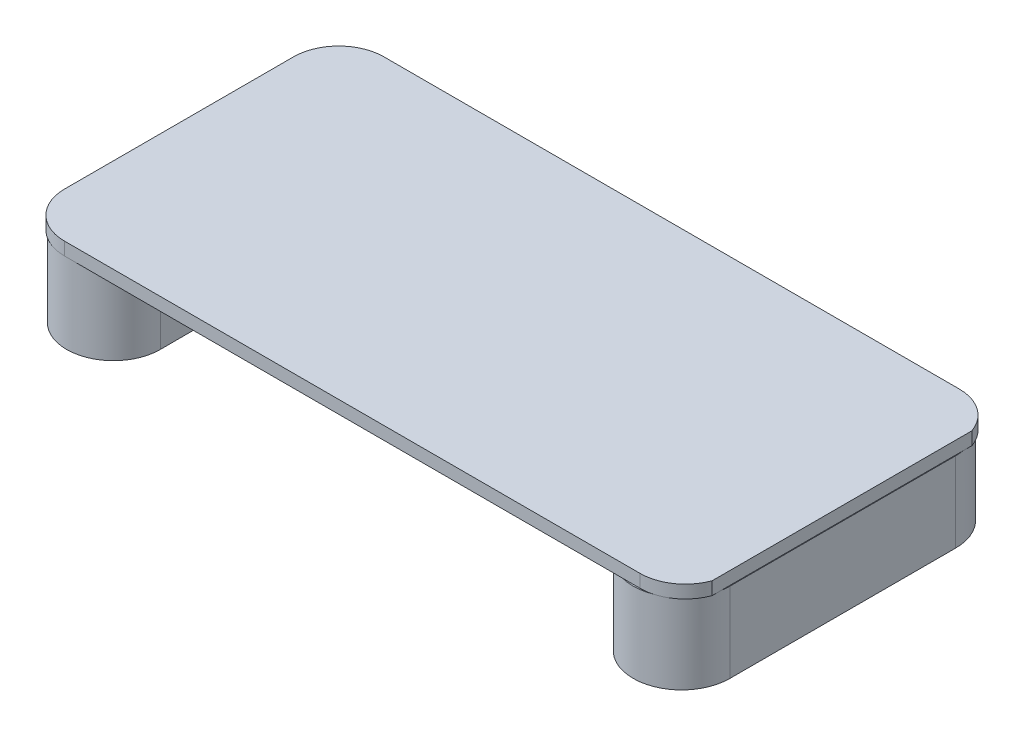
ISO-10303-21;
HEADER;
FILE_DESCRIPTION(('STEP AP214'),'2;1');
FILE_NAME('part.step','',(''),(''),'','','');
FILE_SCHEMA(('AUTOMOTIVE_DESIGN { 1 0 10303 214 1 1 1 1 }'));
ENDSEC;
DATA;
#1=APPLICATION_CONTEXT('core data for automotive mechanical design processes');
#2=APPLICATION_PROTOCOL_DEFINITION('international standard','automotive_design',2000,#1);
#3=PRODUCT_CONTEXT('',#1,'mechanical');
#4=PRODUCT('Part','Part','',(#3));
#5=PRODUCT_RELATED_PRODUCT_CATEGORY('part','',(#4));
#6=PRODUCT_DEFINITION_FORMATION('','',#4);
#7=PRODUCT_DEFINITION_CONTEXT('part definition',#1,'design');
#8=PRODUCT_DEFINITION('design','',#6,#7);
#9=PRODUCT_DEFINITION_SHAPE('','',#8);
#10=(LENGTH_UNIT() NAMED_UNIT(*) SI_UNIT(.MILLI.,.METRE.));
#11=(NAMED_UNIT(*) PLANE_ANGLE_UNIT() SI_UNIT($,.RADIAN.));
#12=(NAMED_UNIT(*) SI_UNIT($,.STERADIAN.) SOLID_ANGLE_UNIT());
#13=UNCERTAINTY_MEASURE_WITH_UNIT(LENGTH_MEASURE(1.E-05),#10,'distance_accuracy_value','');
#14=(GEOMETRIC_REPRESENTATION_CONTEXT(3) GLOBAL_UNCERTAINTY_ASSIGNED_CONTEXT((#13)) GLOBAL_UNIT_ASSIGNED_CONTEXT((#10,
#11,#12)) REPRESENTATION_CONTEXT('',''));
#15=CARTESIAN_POINT('',(0.,0.,0.));
#16=DIRECTION('',(0.,0.,1.));
#17=DIRECTION('',(1.,0.,0.));
#18=AXIS2_PLACEMENT_3D('',#15,#16,#17);
#19=CARTESIAN_POINT('',(0.,20.7,0.));
#20=DIRECTION('',(0.,1.,0.));
#21=DIRECTION('',(0.,0.,1.));
#22=AXIS2_PLACEMENT_3D('',#19,#20,#21);
#23=PLANE('',#22);
#24=CARTESIAN_POINT('',(88.1765540655378,20.7,0.));
#25=DIRECTION('',(0.,-1.,0.));
#26=DIRECTION('',(0.,0.,-1.));
#27=AXIS2_PLACEMENT_3D('',#24,#25,#26);
#28=CIRCLE('',#27,7.49999999999999);
#29=CARTESIAN_POINT('',(90.8872409401359,20.7,-6.99300912825669));
#30=VERTEX_POINT('',#29);
#31=CARTESIAN_POINT('',(95.5769038390663,20.7,-1.21853322869612));
#32=VERTEX_POINT('',#31);
#33=EDGE_CURVE('E495',#30,#32,#28,.T.);
#34=ORIENTED_EDGE('',*,*,#33,.F.);
#35=CARTESIAN_POINT('',(88.9969038390663,20.7,-0.253081410222929));
#36=DIRECTION('',(0.,1.,0.));
#37=DIRECTION('',(0.,0.,1.));
#38=AXIS2_PLACEMENT_3D('',#35,#36,#37);
#39=CIRCLE('',#38,7.);
#40=CARTESIAN_POINT('',(95.5769038390663,20.7,-2.6413025055154));
#41=VERTEX_POINT('',#40);
#42=EDGE_CURVE('E435',#30,#41,#39,.F.);
#43=ORIENTED_EDGE('',*,*,#42,.T.);
#44=DIRECTION('',(0.,0.,1.));
#45=VECTOR('',#44,1.);
#46=CARTESIAN_POINT('',(95.5769038390663,20.7,0.));
#47=LINE('',#46,#45);
#48=EDGE_CURVE('E227',#41,#32,#47,.T.);
#49=ORIENTED_EDGE('',*,*,#48,.T.);
#50=EDGE_LOOP('',(#34,#43,#49));
#51=FACE_BOUND('',#50,.T.);
#52=ADVANCED_FACE('F41',(#51),#23,.F.);
#53=CARTESIAN_POINT('',(88.1765540655378,20.7,35.01));
#54=DIRECTION('',(0.,-1.,0.));
#55=DIRECTION('',(0.,0.,-1.));
#56=AXIS2_PLACEMENT_3D('',#53,#54,#55);
#57=CIRCLE('',#56,7.50000000000002);
#58=CARTESIAN_POINT('',(95.5769038390663,20.7,36.2285332286963));
#59=VERTEX_POINT('',#58);
#60=CARTESIAN_POINT('',(90.8484712410928,20.7,42.0179139982576));
#61=VERTEX_POINT('',#60);
#62=EDGE_CURVE('E426',#59,#61,#57,.T.);
#63=ORIENTED_EDGE('',*,*,#62,.F.);
#64=CARTESIAN_POINT('',(95.5769038390663,20.7,37.6554537830635));
#65=VERTEX_POINT('',#64);
#66=EDGE_CURVE('E226',#59,#65,#47,.T.);
#67=ORIENTED_EDGE('',*,*,#66,.T.);
#68=CARTESIAN_POINT('',(88.9969038390663,20.7,35.267232687771));
#69=DIRECTION('',(0.,1.,0.));
#70=DIRECTION('',(0.,0.,1.));
#71=AXIS2_PLACEMENT_3D('',#68,#69,#70);
#72=CIRCLE('',#71,7.);
#73=EDGE_CURVE('E423',#65,#61,#72,.F.);
#74=ORIENTED_EDGE('',*,*,#73,.T.);
#75=EDGE_LOOP('',(#63,#67,#74));
#76=FACE_BOUND('',#75,.T.);
#77=ADVANCED_FACE('F362',(#76),#23,.F.);
#78=CARTESIAN_POINT('',(80.6765540655378,20.7,0.));
#79=VERTEX_POINT('',#78);
#80=CARTESIAN_POINT('',(86.2679393698283,20.7,-7.25308141022293));
#81=VERTEX_POINT('',#80);
#82=EDGE_CURVE('E59',#79,#81,#28,.T.);
#83=ORIENTED_EDGE('',*,*,#82,.F.);
#84=DIRECTION('',(0.,0.,-1.));
#85=VECTOR('',#84,1.);
#86=CARTESIAN_POINT('',(80.6765540655378,20.7,0.));
#87=LINE('',#86,#85);
#88=CARTESIAN_POINT('',(80.6765540655378,20.7,35.01));
#89=VERTEX_POINT('',#88);
#90=EDGE_CURVE('E63',#89,#79,#87,.T.);
#91=ORIENTED_EDGE('',*,*,#90,.F.);
#92=CARTESIAN_POINT('',(86.2837852694223,20.7,42.267232687771));
#93=VERTEX_POINT('',#92);
#94=EDGE_CURVE('E501',#93,#89,#57,.T.);
#95=ORIENTED_EDGE('',*,*,#94,.F.);
#96=DIRECTION('',(1.,0.,0.));
#97=VECTOR('',#96,1.);
#98=CARTESIAN_POINT('',(-7.25309616093367,20.7,42.267232687771));
#99=LINE('',#98,#97);
#100=CARTESIAN_POINT('',(-0.253096160933671,20.7,42.267232687771));
#101=VERTEX_POINT('',#100);
#102=EDGE_CURVE('E253',#101,#93,#99,.T.);
#103=ORIENTED_EDGE('',*,*,#102,.F.);
#104=CARTESIAN_POINT('',(-0.253096160933671,20.7,35.267232687771));
#105=DIRECTION('',(0.,1.,0.));
#106=DIRECTION('',(0.,0.,1.));
#107=AXIS2_PLACEMENT_3D('',#104,#105,#106);
#108=CIRCLE('',#107,7.);
#109=CARTESIAN_POINT('',(-7.25309616093367,20.7,35.267232687771));
#110=VERTEX_POINT('',#109);
#111=EDGE_CURVE('E436',#101,#110,#108,.F.);
#112=ORIENTED_EDGE('',*,*,#111,.T.);
#113=DIRECTION('',(0.,0.,1.));
#114=VECTOR('',#113,1.);
#115=CARTESIAN_POINT('',(-7.25309616093368,20.7,-7.25308141022293));
#116=LINE('',#115,#114);
#117=CARTESIAN_POINT('',(-7.25309616093368,20.7,0.));
#118=VERTEX_POINT('',#117);
#119=EDGE_CURVE('E235',#118,#110,#116,.T.);
#120=ORIENTED_EDGE('',*,*,#119,.F.);
#121=CARTESIAN_POINT('',(0.,20.7,0.));
#122=DIRECTION('',(0.,1.,0.));
#123=DIRECTION('',(0.,0.,1.));
#124=AXIS2_PLACEMENT_3D('',#121,#122,#123);
#125=CIRCLE('',#124,7.25309616093368);
#126=CARTESIAN_POINT('',(-7.25308141022293,20.7,0.0146279331896265));
#127=VERTEX_POINT('',#126);
#128=EDGE_CURVE('E259',#118,#127,#125,.T.);
#129=ORIENTED_EDGE('',*,*,#128,.T.);
#130=DIRECTION('',(0.0020167846758209,0.,0.999997966287718));
#131=VECTOR('',#130,1.);
#132=CARTESIAN_POINT('',(-7.25308141022293,20.7,0.0146279331896265));
#133=LINE('',#132,#131);
#134=CARTESIAN_POINT('',(-7.18247102120448,20.7,35.0259240144122));
#135=VERTEX_POINT('',#134);
#136=EDGE_CURVE('E275',#127,#135,#133,.T.);
#137=ORIENTED_EDGE('',*,*,#136,.T.);
#138=CARTESIAN_POINT('',(0.0706103890184538,20.7,35.0112960812226));
#139=DIRECTION('',(0.,1.,0.));
#140=DIRECTION('',(0.,0.,1.));
#141=AXIS2_PLACEMENT_3D('',#138,#139,#140);
#142=CIRCLE('',#141,7.25309616093368);
#143=CARTESIAN_POINT('',(7.32369179924138,20.7,34.9966681480329));
#144=VERTEX_POINT('',#143);
#145=EDGE_CURVE('E279',#135,#144,#142,.T.);
#146=ORIENTED_EDGE('',*,*,#145,.T.);
#147=DIRECTION('',(-0.0020167846758209,0.,-0.999997966287718));
#148=VECTOR('',#147,1.);
#149=CARTESIAN_POINT('',(7.25308141022293,20.7,-0.0146279331896265));
#150=LINE('',#149,#148);
#151=CARTESIAN_POINT('',(7.25308141022293,20.7,-0.0146279331896265));
#152=VERTEX_POINT('',#151);
#153=EDGE_CURVE('E284',#144,#152,#150,.T.);
#154=ORIENTED_EDGE('',*,*,#153,.T.);
#155=CARTESIAN_POINT('',(0.0146279331901802,20.7,-7.25308141022293));
#156=VERTEX_POINT('',#155);
#157=EDGE_CURVE('E280',#152,#156,#125,.T.);
#158=ORIENTED_EDGE('',*,*,#157,.T.);
#159=DIRECTION('',(-1.,0.,0.));
#160=VECTOR('',#159,1.);
#161=CARTESIAN_POINT('',(-7.25309616093368,20.7,-7.25308141022293));
#162=LINE('',#161,#160);
#163=EDGE_CURVE('E45',#81,#156,#162,.T.);
#164=ORIENTED_EDGE('',*,*,#163,.F.);
#165=EDGE_LOOP('',(#83,#91,#95,#103,#112,#120,#129,#137,#146,#154,#158,#164));
#166=FACE_BOUND('',#165,.T.);
#167=ADVANCED_FACE('F369',(#166),#23,.F.);
#168=CARTESIAN_POINT('',(0.,8.3,0.));
#169=DIRECTION('',(0.,1.,0.));
#170=DIRECTION('',(0.,0.,1.));
#171=AXIS2_PLACEMENT_3D('',#168,#169,#170);
#172=PLANE('',#171);
#173=CARTESIAN_POINT('',(0.,8.3,0.));
#174=DIRECTION('',(0.,1.,0.));
#175=DIRECTION('',(0.,0.,1.));
#176=AXIS2_PLACEMENT_3D('',#173,#174,#175);
#177=CIRCLE('',#176,7.25309616093368);
#178=CARTESIAN_POINT('',(7.25308141022293,8.3,-0.0146279331896265));
#179=VERTEX_POINT('',#178);
#180=CARTESIAN_POINT('',(-7.25308141022293,8.3,0.0146279331896265));
#181=VERTEX_POINT('',#180);
#182=EDGE_CURVE('E249',#179,#181,#177,.T.);
#183=ORIENTED_EDGE('',*,*,#182,.F.);
#184=DIRECTION('',(-0.0020167846758209,0.,-0.999997966287718));
#185=VECTOR('',#184,1.);
#186=CARTESIAN_POINT('',(7.25308141022293,8.3,-0.0146279331896265));
#187=LINE('',#186,#185);
#188=CARTESIAN_POINT('',(7.32369179924138,8.3,34.9966681480329));
#189=VERTEX_POINT('',#188);
#190=EDGE_CURVE('E298',#189,#179,#187,.T.);
#191=ORIENTED_EDGE('',*,*,#190,.F.);
#192=CARTESIAN_POINT('',(0.0706103890184538,8.3,35.0112960812226));
#193=DIRECTION('',(0.,1.,0.));
#194=DIRECTION('',(0.,0.,1.));
#195=AXIS2_PLACEMENT_3D('',#192,#193,#194);
#196=CIRCLE('',#195,7.25309616093368);
#197=CARTESIAN_POINT('',(-7.18247102120448,8.3,35.0259240144122));
#198=VERTEX_POINT('',#197);
#199=EDGE_CURVE('E295',#198,#189,#196,.T.);
#200=ORIENTED_EDGE('',*,*,#199,.F.);
#201=DIRECTION('',(0.0020167846758209,0.,0.999997966287718));
#202=VECTOR('',#201,1.);
#203=CARTESIAN_POINT('',(-7.25308141022293,8.3,0.0146279331896265));
#204=LINE('',#203,#202);
#205=EDGE_CURVE('E292',#181,#198,#204,.T.);
#206=ORIENTED_EDGE('',*,*,#205,.F.);
#207=EDGE_LOOP('',(#183,#191,#200,#206));
#208=FACE_BOUND('',#207,.T.);
#209=ADVANCED_FACE('F342',(#208),#172,.F.);
#210=CARTESIAN_POINT('',(0.,20.7,0.));
#211=DIRECTION('',(0.,-1.,0.));
#212=DIRECTION('',(0.,0.,-1.));
#213=AXIS2_PLACEMENT_3D('',#210,#211,#212);
#214=CYLINDRICAL_SURFACE('',#213,7.25309616093368);
#215=ORIENTED_EDGE('',*,*,#182,.T.);
#216=DIRECTION('',(0.,-1.,0.));
#217=VECTOR('',#216,1.);
#218=CARTESIAN_POINT('',(-7.25308141022293,20.7,0.0146279331896265));
#219=LINE('',#218,#217);
#220=EDGE_CURVE('E312',#127,#181,#219,.T.);
#221=ORIENTED_EDGE('',*,*,#220,.F.);
#222=ORIENTED_EDGE('',*,*,#128,.F.);
#223=CARTESIAN_POINT('',(-0.0146279331901819,20.7,-7.25308141022293));
#224=VERTEX_POINT('',#223);
#225=EDGE_CURVE('E320',#224,#118,#125,.T.);
#226=ORIENTED_EDGE('',*,*,#225,.F.);
#227=CARTESIAN_POINT('',(0.0146279331901785,20.7,-7.25308141022293));
#228=DIRECTION('',(-1.,0.,0.));
#229=VECTOR('',#228,1.);
#230=LINE('',#227,#229);
#231=EDGE_CURVE('E316',#156,#224,#230,.T.);
#232=ORIENTED_EDGE('',*,*,#231,.F.);
#233=ORIENTED_EDGE('',*,*,#157,.F.);
#234=DIRECTION('',(0.,-1.,0.));
#235=VECTOR('',#234,1.);
#236=CARTESIAN_POINT('',(7.25308141022293,20.7,-0.0146279331896265));
#237=LINE('',#236,#235);
#238=EDGE_CURVE('E288',#152,#179,#237,.T.);
#239=ORIENTED_EDGE('',*,*,#238,.T.);
#240=EDGE_LOOP('',(#215,#221,#222,#226,#232,#233,#239));
#241=FACE_BOUND('',#240,.T.);
#242=ADVANCED_FACE('F331',(#241),#214,.T.);
#243=CARTESIAN_POINT('',(-7.25308141022293,20.7,0.0146279331896265));
#244=DIRECTION('',(0.999997966287718,0.,-0.0020167846758209));
#245=DIRECTION('',(-0.0020167846758209,0.,-0.999997966287718));
#246=AXIS2_PLACEMENT_3D('',#243,#244,#245);
#247=PLANE('',#246);
#248=ORIENTED_EDGE('',*,*,#205,.T.);
#249=DIRECTION('',(0.,-1.,0.));
#250=VECTOR('',#249,1.);
#251=CARTESIAN_POINT('',(-7.18247102120448,20.7,35.0259240144122));
#252=LINE('',#251,#250);
#253=EDGE_CURVE('E308',#135,#198,#252,.T.);
#254=ORIENTED_EDGE('',*,*,#253,.F.);
#255=ORIENTED_EDGE('',*,*,#136,.F.);
#256=ORIENTED_EDGE('',*,*,#220,.T.);
#257=EDGE_LOOP('',(#248,#254,#255,#256));
#258=FACE_BOUND('',#257,.T.);
#259=ADVANCED_FACE('F341',(#258),#247,.F.);
#260=CARTESIAN_POINT('',(0.0706103890184538,20.7,35.0112960812226));
#261=DIRECTION('',(0.,-1.,0.));
#262=DIRECTION('',(0.,0.,-1.));
#263=AXIS2_PLACEMENT_3D('',#260,#261,#262);
#264=CYLINDRICAL_SURFACE('',#263,7.25309616093368);
#265=ORIENTED_EDGE('',*,*,#199,.T.);
#266=DIRECTION('',(0.,-1.,0.));
#267=VECTOR('',#266,1.);
#268=CARTESIAN_POINT('',(7.32369179924138,20.7,34.9966681480329));
#269=LINE('',#268,#267);
#270=EDGE_CURVE('E304',#144,#189,#269,.T.);
#271=ORIENTED_EDGE('',*,*,#270,.F.);
#272=ORIENTED_EDGE('',*,*,#145,.F.);
#273=ORIENTED_EDGE('',*,*,#253,.T.);
#274=EDGE_LOOP('',(#265,#271,#272,#273));
#275=FACE_BOUND('',#274,.T.);
#276=ADVANCED_FACE('F383',(#275),#264,.T.);
#277=CARTESIAN_POINT('',(7.25308141022293,20.7,-0.0146279331896265));
#278=DIRECTION('',(-0.999997966287718,0.,0.0020167846758209));
#279=DIRECTION('',(0.0020167846758209,0.,0.999997966287718));
#280=AXIS2_PLACEMENT_3D('',#277,#278,#279);
#281=PLANE('',#280);
#282=ORIENTED_EDGE('',*,*,#190,.T.);
#283=ORIENTED_EDGE('',*,*,#238,.F.);
#284=ORIENTED_EDGE('',*,*,#153,.F.);
#285=ORIENTED_EDGE('',*,*,#270,.T.);
#286=EDGE_LOOP('',(#282,#283,#284,#285));
#287=FACE_BOUND('',#286,.T.);
#288=ADVANCED_FACE('F374',(#287),#281,.F.);
#289=CARTESIAN_POINT('',(-7.25309616093368,20.7,-0.253081410222929));
#290=VERTEX_POINT('',#289);
#291=EDGE_CURVE('E250',#290,#118,#116,.T.);
#292=ORIENTED_EDGE('',*,*,#291,.F.);
#293=CARTESIAN_POINT('',(-0.253096160933676,20.7,-0.25308141022293));
#294=DIRECTION('',(0.,1.,0.));
#295=DIRECTION('',(0.,0.,1.));
#296=AXIS2_PLACEMENT_3D('',#293,#294,#295);
#297=CIRCLE('',#296,7.);
#298=CARTESIAN_POINT('',(-0.253096160933678,20.7,-7.25308141022293));
#299=VERTEX_POINT('',#298);
#300=EDGE_CURVE('E52',#290,#299,#297,.F.);
#301=ORIENTED_EDGE('',*,*,#300,.T.);
#302=EDGE_CURVE('E256',#224,#299,#162,.T.);
#303=ORIENTED_EDGE('',*,*,#302,.F.);
#304=ORIENTED_EDGE('',*,*,#225,.T.);
#305=EDGE_LOOP('',(#292,#301,#303,#304));
#306=FACE_BOUND('',#305,.T.);
#307=ADVANCED_FACE('F365',(#306),#23,.F.);
#308=CARTESIAN_POINT('',(-7.25309616093368,22.7,-7.25308141022293));
#309=DIRECTION('',(1.,0.,0.));
#310=DIRECTION('',(0.,0.,-1.));
#311=AXIS2_PLACEMENT_3D('',#308,#309,#310);
#312=PLANE('',#311);
#313=DIRECTION('',(0.,0.,1.));
#314=VECTOR('',#313,1.);
#315=CARTESIAN_POINT('',(-7.25309616093368,22.7,-7.25308141022293));
#316=LINE('',#315,#314);
#317=CARTESIAN_POINT('',(-7.25309616093368,22.7,-0.253081410222929));
#318=VERTEX_POINT('',#317);
#319=CARTESIAN_POINT('',(-7.25309616093367,22.7,35.267232687771));
#320=VERTEX_POINT('',#319);
#321=EDGE_CURVE('E236',#318,#320,#316,.T.);
#322=ORIENTED_EDGE('',*,*,#321,.F.);
#323=DIRECTION('',(0.,-1.,0.));
#324=VECTOR('',#323,1.);
#325=CARTESIAN_POINT('',(-7.25309616093368,22.7,-0.253081410222929));
#326=LINE('',#325,#324);
#327=EDGE_CURVE('E470',#318,#290,#326,.T.);
#328=ORIENTED_EDGE('',*,*,#327,.T.);
#329=ORIENTED_EDGE('',*,*,#291,.T.);
#330=ORIENTED_EDGE('',*,*,#119,.T.);
#331=DIRECTION('',(0.,-1.,0.));
#332=VECTOR('',#331,1.);
#333=CARTESIAN_POINT('',(-7.25309616093367,22.7,35.267232687771));
#334=LINE('',#333,#332);
#335=EDGE_CURVE('E467',#110,#320,#334,.F.);
#336=ORIENTED_EDGE('',*,*,#335,.T.);
#337=EDGE_LOOP('',(#322,#328,#329,#330,#336));
#338=FACE_BOUND('',#337,.T.);
#339=ADVANCED_FACE('F373',(#338),#312,.F.);
#340=CARTESIAN_POINT('',(-7.25309616093367,22.7,42.267232687771));
#341=DIRECTION('',(0.,0.,-1.));
#342=DIRECTION('',(-1.,0.,0.));
#343=AXIS2_PLACEMENT_3D('',#340,#341,#342);
#344=PLANE('',#343);
#345=ORIENTED_EDGE('',*,*,#102,.T.);
#346=DIRECTION('',(-1.,0.,0.));
#347=VECTOR('',#346,1.);
#348=CARTESIAN_POINT('',(-7.25309616093367,20.7,42.267232687771));
#349=LINE('',#348,#347);
#350=CARTESIAN_POINT('',(88.9969038390663,20.7,42.267232687771));
#351=VERTEX_POINT('',#350);
#352=EDGE_CURVE('E214',#351,#93,#349,.T.);
#353=ORIENTED_EDGE('',*,*,#352,.F.);
#354=DIRECTION('',(0.,-1.,0.));
#355=VECTOR('',#354,1.);
#356=CARTESIAN_POINT('',(88.9969038390663,22.7,42.267232687771));
#357=LINE('',#356,#355);
#358=CARTESIAN_POINT('',(88.9969038390663,22.7,42.267232687771));
#359=VERTEX_POINT('',#358);
#360=EDGE_CURVE('E464',#351,#359,#357,.F.);
#361=ORIENTED_EDGE('',*,*,#360,.T.);
#362=DIRECTION('',(1.,0.,0.));
#363=VECTOR('',#362,1.);
#364=CARTESIAN_POINT('',(-7.25309616093367,22.7,42.267232687771));
#365=LINE('',#364,#363);
#366=CARTESIAN_POINT('',(-0.253096160933671,22.7,42.267232687771));
#367=VERTEX_POINT('',#366);
#368=EDGE_CURVE('E240',#367,#359,#365,.T.);
#369=ORIENTED_EDGE('',*,*,#368,.F.);
#370=DIRECTION('',(0.,-1.,0.));
#371=VECTOR('',#370,1.);
#372=CARTESIAN_POINT('',(-0.253096160933671,22.7,42.267232687771));
#373=LINE('',#372,#371);
#374=EDGE_CURVE('E460',#367,#101,#373,.T.);
#375=ORIENTED_EDGE('',*,*,#374,.T.);
#376=EDGE_LOOP('',(#345,#353,#361,#369,#375));
#377=FACE_BOUND('',#376,.T.);
#378=ADVANCED_FACE('F380',(#377),#344,.F.);
#379=CARTESIAN_POINT('',(-7.25309616093368,22.7,-7.25308141022293));
#380=DIRECTION('',(0.,0.,1.));
#381=DIRECTION('',(1.,0.,0.));
#382=AXIS2_PLACEMENT_3D('',#379,#380,#381);
#383=PLANE('',#382);
#384=DIRECTION('',(-1.,0.,0.));
#385=VECTOR('',#384,1.);
#386=CARTESIAN_POINT('',(-7.25309616093368,22.7,-7.25308141022293));
#387=LINE('',#386,#385);
#388=CARTESIAN_POINT('',(88.9969038390663,22.7,-7.25308141022293));
#389=VERTEX_POINT('',#388);
#390=CARTESIAN_POINT('',(-0.253096160933678,22.7,-7.25308141022293));
#391=VERTEX_POINT('',#390);
#392=EDGE_CURVE('E245',#389,#391,#387,.T.);
#393=ORIENTED_EDGE('',*,*,#392,.F.);
#394=DIRECTION('',(0.,-1.,0.));
#395=VECTOR('',#394,1.);
#396=CARTESIAN_POINT('',(88.9969038390663,22.7,-7.25308141022293));
#397=LINE('',#396,#395);
#398=CARTESIAN_POINT('',(88.9969038390663,20.7,-7.25308141022293));
#399=VERTEX_POINT('',#398);
#400=EDGE_CURVE('E442',#389,#399,#397,.T.);
#401=ORIENTED_EDGE('',*,*,#400,.T.);
#402=EDGE_CURVE('E241',#399,#81,#162,.T.);
#403=ORIENTED_EDGE('',*,*,#402,.T.);
#404=ORIENTED_EDGE('',*,*,#163,.T.);
#405=ORIENTED_EDGE('',*,*,#231,.T.);
#406=ORIENTED_EDGE('',*,*,#302,.T.);
#407=DIRECTION('',(0.,-1.,0.));
#408=VECTOR('',#407,1.);
#409=CARTESIAN_POINT('',(-0.253096160933676,22.7,-7.25308141022293));
#410=LINE('',#409,#408);
#411=EDGE_CURVE('E481',#299,#391,#410,.F.);
#412=ORIENTED_EDGE('',*,*,#411,.T.);
#413=EDGE_LOOP('',(#393,#401,#403,#404,#405,#406,#412));
#414=FACE_BOUND('',#413,.T.);
#415=ADVANCED_FACE('F480',(#414),#383,.F.);
#416=CARTESIAN_POINT('',(0.,22.7,0.));
#417=DIRECTION('',(0.,1.,0.));
#418=DIRECTION('',(0.,0.,1.));
#419=AXIS2_PLACEMENT_3D('',#416,#417,#418);
#420=PLANE('',#419);
#421=DIRECTION('',(0.,0.,1.));
#422=VECTOR('',#421,1.);
#423=CARTESIAN_POINT('',(95.5769038390663,22.7,0.));
#424=LINE('',#423,#422);
#425=CARTESIAN_POINT('',(95.5769038390663,22.7,-2.6413025055154));
#426=VERTEX_POINT('',#425);
#427=CARTESIAN_POINT('',(95.5769038390663,22.7,37.6554537830635));
#428=VERTEX_POINT('',#427);
#429=EDGE_CURVE('E223',#426,#428,#424,.T.);
#430=ORIENTED_EDGE('',*,*,#429,.F.);
#431=CARTESIAN_POINT('',(88.9969038390663,22.7,-0.253081410222929));
#432=DIRECTION('',(0.,1.,0.));
#433=DIRECTION('',(0.,0.,1.));
#434=AXIS2_PLACEMENT_3D('',#431,#432,#433);
#435=CIRCLE('',#434,7.);
#436=EDGE_CURVE('E457',#426,#389,#435,.T.);
#437=ORIENTED_EDGE('',*,*,#436,.T.);
#438=ORIENTED_EDGE('',*,*,#392,.T.);
#439=CARTESIAN_POINT('',(-0.253096160933676,22.7,-0.25308141022293));
#440=DIRECTION('',(0.,1.,0.));
#441=DIRECTION('',(0.,0.,1.));
#442=AXIS2_PLACEMENT_3D('',#439,#440,#441);
#443=CIRCLE('',#442,7.);
#444=EDGE_CURVE('E451',#391,#318,#443,.T.);
#445=ORIENTED_EDGE('',*,*,#444,.T.);
#446=ORIENTED_EDGE('',*,*,#321,.T.);
#447=CARTESIAN_POINT('',(-0.253096160933671,22.7,35.267232687771));
#448=DIRECTION('',(0.,1.,0.));
#449=DIRECTION('',(0.,0.,1.));
#450=AXIS2_PLACEMENT_3D('',#447,#448,#449);
#451=CIRCLE('',#450,7.);
#452=EDGE_CURVE('E448',#320,#367,#451,.T.);
#453=ORIENTED_EDGE('',*,*,#452,.T.);
#454=ORIENTED_EDGE('',*,*,#368,.T.);
#455=CARTESIAN_POINT('',(88.9969038390663,22.7,35.267232687771));
#456=DIRECTION('',(0.,1.,0.));
#457=DIRECTION('',(0.,0.,1.));
#458=AXIS2_PLACEMENT_3D('',#455,#456,#457);
#459=CIRCLE('',#458,7.);
#460=EDGE_CURVE('E454',#359,#428,#459,.T.);
#461=ORIENTED_EDGE('',*,*,#460,.T.);
#462=EDGE_LOOP('',(#430,#437,#438,#445,#446,#453,#454,#461));
#463=FACE_BOUND('',#462,.T.);
#464=ADVANCED_FACE('F348',(#463),#420,.T.);
#465=CARTESIAN_POINT('',(88.9969038390663,22.7,-0.253081410222929));
#466=DIRECTION('',(0.,-1.,0.));
#467=DIRECTION('',(0.,0.,-1.));
#468=AXIS2_PLACEMENT_3D('',#465,#466,#467);
#469=CYLINDRICAL_SURFACE('',#468,7.);
#470=DIRECTION('',(0.,-1.,0.));
#471=VECTOR('',#470,1.);
#472=CARTESIAN_POINT('',(95.5769038390663,22.7,-2.6413025055154));
#473=LINE('',#472,#471);
#474=EDGE_CURVE('E231',#41,#426,#473,.F.);
#475=ORIENTED_EDGE('',*,*,#474,.F.);
#476=ORIENTED_EDGE('',*,*,#42,.F.);
#477=EDGE_CURVE('E440',#399,#30,#39,.F.);
#478=ORIENTED_EDGE('',*,*,#477,.F.);
#479=ORIENTED_EDGE('',*,*,#400,.F.);
#480=ORIENTED_EDGE('',*,*,#436,.F.);
#481=EDGE_LOOP('',(#475,#476,#478,#479,#480));
#482=FACE_BOUND('',#481,.T.);
#483=ADVANCED_FACE('F344',(#482),#469,.T.);
#484=CARTESIAN_POINT('',(88.9969038390663,22.7,35.267232687771));
#485=DIRECTION('',(0.,-1.,0.));
#486=DIRECTION('',(0.,0.,-1.));
#487=AXIS2_PLACEMENT_3D('',#484,#485,#486);
#488=CYLINDRICAL_SURFACE('',#487,7.);
#489=DIRECTION('',(0.,-1.,0.));
#490=VECTOR('',#489,1.);
#491=CARTESIAN_POINT('',(95.5769038390663,22.7,37.6554537830635));
#492=LINE('',#491,#490);
#493=EDGE_CURVE('E12',#428,#65,#492,.T.);
#494=ORIENTED_EDGE('',*,*,#493,.F.);
#495=ORIENTED_EDGE('',*,*,#460,.F.);
#496=ORIENTED_EDGE('',*,*,#360,.F.);
#497=CARTESIAN_POINT('',(88.9969038390663,20.7,35.267232687771));
#498=DIRECTION('',(0.,-1.,0.));
#499=DIRECTION('',(0.,0.,-1.));
#500=AXIS2_PLACEMENT_3D('',#497,#498,#499);
#501=CIRCLE('',#500,7.);
#502=EDGE_CURVE('E210',#351,#61,#501,.F.);
#503=ORIENTED_EDGE('',*,*,#502,.T.);
#504=ORIENTED_EDGE('',*,*,#73,.F.);
#505=EDGE_LOOP('',(#494,#495,#496,#503,#504));
#506=FACE_BOUND('',#505,.T.);
#507=ADVANCED_FACE('F347',(#506),#488,.T.);
#508=CARTESIAN_POINT('',(-0.253096160933676,22.7,-0.25308141022293));
#509=DIRECTION('',(0.,-1.,0.));
#510=DIRECTION('',(0.,0.,-1.));
#511=AXIS2_PLACEMENT_3D('',#508,#509,#510);
#512=CYLINDRICAL_SURFACE('',#511,7.);
#513=ORIENTED_EDGE('',*,*,#444,.F.);
#514=ORIENTED_EDGE('',*,*,#411,.F.);
#515=ORIENTED_EDGE('',*,*,#300,.F.);
#516=ORIENTED_EDGE('',*,*,#327,.F.);
#517=EDGE_LOOP('',(#513,#514,#515,#516));
#518=FACE_BOUND('',#517,.T.);
#519=ADVANCED_FACE('F351',(#518),#512,.T.);
#520=CARTESIAN_POINT('',(-0.253096160933671,22.7,35.267232687771));
#521=DIRECTION('',(0.,-1.,0.));
#522=DIRECTION('',(0.,0.,-1.));
#523=AXIS2_PLACEMENT_3D('',#520,#521,#522);
#524=CYLINDRICAL_SURFACE('',#523,7.);
#525=ORIENTED_EDGE('',*,*,#452,.F.);
#526=ORIENTED_EDGE('',*,*,#335,.F.);
#527=ORIENTED_EDGE('',*,*,#111,.F.);
#528=ORIENTED_EDGE('',*,*,#374,.F.);
#529=EDGE_LOOP('',(#525,#526,#527,#528));
#530=FACE_BOUND('',#529,.T.);
#531=ADVANCED_FACE('F43',(#530),#524,.T.);
#532=CARTESIAN_POINT('',(95.5769038390663,0.,0.));
#533=DIRECTION('',(-1.,0.,0.));
#534=DIRECTION('',(0.,0.,1.));
#535=AXIS2_PLACEMENT_3D('',#532,#533,#534);
#536=PLANE('',#535);
#537=ORIENTED_EDGE('',*,*,#474,.T.);
#538=ORIENTED_EDGE('',*,*,#429,.T.);
#539=ORIENTED_EDGE('',*,*,#493,.T.);
#540=ORIENTED_EDGE('',*,*,#66,.F.);
#541=EDGE_CURVE('E232',#32,#59,#47,.T.);
#542=ORIENTED_EDGE('',*,*,#541,.F.);
#543=ORIENTED_EDGE('',*,*,#48,.F.);
#544=EDGE_LOOP('',(#537,#538,#539,#540,#542,#543));
#545=FACE_BOUND('',#544,.T.);
#546=ADVANCED_FACE('F358',(#545),#536,.F.);
#547=CARTESIAN_POINT('',(88.1765540655378,20.7,0.));
#548=DIRECTION('',(0.,-1.,0.));
#549=DIRECTION('',(0.,0.,-1.));
#550=AXIS2_PLACEMENT_3D('',#547,#548,#549);
#551=PLANE('',#550);
#552=EDGE_CURVE('E493',#81,#30,#28,.T.);
#553=ORIENTED_EDGE('',*,*,#552,.F.);
#554=ORIENTED_EDGE('',*,*,#402,.F.);
#555=ORIENTED_EDGE('',*,*,#477,.T.);
#556=EDGE_LOOP('',(#553,#554,#555));
#557=FACE_BOUND('',#556,.T.);
#558=ADVANCED_FACE('F491',(#557),#551,.F.);
#559=ORIENTED_EDGE('',*,*,#502,.F.);
#560=ORIENTED_EDGE('',*,*,#352,.T.);
#561=EDGE_CURVE('E515',#61,#93,#57,.T.);
#562=ORIENTED_EDGE('',*,*,#561,.F.);
#563=EDGE_LOOP('',(#559,#560,#562));
#564=FACE_BOUND('',#563,.T.);
#565=ADVANCED_FACE('F513',(#564),#551,.F.);
#566=CARTESIAN_POINT('',(95.6765540655378,20.7,0.));
#567=VERTEX_POINT('',#566);
#568=EDGE_CURVE('E207',#32,#567,#28,.T.);
#569=ORIENTED_EDGE('',*,*,#568,.F.);
#570=ORIENTED_EDGE('',*,*,#541,.T.);
#571=CARTESIAN_POINT('',(95.6765540655378,20.7,35.01));
#572=VERTEX_POINT('',#571);
#573=EDGE_CURVE('E522',#572,#59,#57,.T.);
#574=ORIENTED_EDGE('',*,*,#573,.F.);
#575=DIRECTION('',(0.,0.,1.));
#576=VECTOR('',#575,1.);
#577=CARTESIAN_POINT('',(95.6765540655378,20.7,0.));
#578=LINE('',#577,#576);
#579=EDGE_CURVE('E499',#567,#572,#578,.T.);
#580=ORIENTED_EDGE('',*,*,#579,.F.);
#581=EDGE_LOOP('',(#569,#570,#574,#580));
#582=FACE_BOUND('',#581,.T.);
#583=ADVANCED_FACE('F555',(#582),#551,.F.);
#584=CARTESIAN_POINT('',(88.1765540655378,8.3,0.));
#585=DIRECTION('',(0.,1.,0.));
#586=DIRECTION('',(0.,0.,1.));
#587=AXIS2_PLACEMENT_3D('',#584,#585,#586);
#588=CYLINDRICAL_SURFACE('',#587,7.49999999999999);
#589=ORIENTED_EDGE('',*,*,#82,.T.);
#590=ORIENTED_EDGE('',*,*,#552,.T.);
#591=ORIENTED_EDGE('',*,*,#33,.T.);
#592=ORIENTED_EDGE('',*,*,#568,.T.);
#593=DIRECTION('',(0.,1.,0.));
#594=VECTOR('',#593,1.);
#595=CARTESIAN_POINT('',(95.6765540655378,8.3,0.));
#596=LINE('',#595,#594);
#597=CARTESIAN_POINT('',(95.6765540655378,8.3,0.));
#598=VERTEX_POINT('',#597);
#599=EDGE_CURVE('E186',#598,#567,#596,.T.);
#600=ORIENTED_EDGE('',*,*,#599,.F.);
#601=CARTESIAN_POINT('',(88.1765540655378,8.3,0.));
#602=DIRECTION('',(0.,-1.,0.));
#603=DIRECTION('',(0.,0.,-1.));
#604=AXIS2_PLACEMENT_3D('',#601,#602,#603);
#605=CIRCLE('',#604,7.49999999999999);
#606=CARTESIAN_POINT('',(80.6765540655378,8.3,0.));
#607=VERTEX_POINT('',#606);
#608=EDGE_CURVE('E193',#607,#598,#605,.T.);
#609=ORIENTED_EDGE('',*,*,#608,.F.);
#610=DIRECTION('',(0.,1.,0.));
#611=VECTOR('',#610,1.);
#612=CARTESIAN_POINT('',(80.6765540655378,8.3,0.));
#613=LINE('',#612,#611);
#614=EDGE_CURVE('E497',#607,#79,#613,.T.);
#615=ORIENTED_EDGE('',*,*,#614,.T.);
#616=EDGE_LOOP('',(#589,#590,#591,#592,#600,#609,#615));
#617=FACE_BOUND('',#616,.T.);
#618=ADVANCED_FACE('F204',(#617),#588,.T.);
#619=CARTESIAN_POINT('',(95.6765540655378,8.3,0.));
#620=DIRECTION('',(-1.,0.,0.));
#621=DIRECTION('',(0.,0.,1.));
#622=AXIS2_PLACEMENT_3D('',#619,#620,#621);
#623=PLANE('',#622);
#624=ORIENTED_EDGE('',*,*,#579,.T.);
#625=DIRECTION('',(0.,1.,0.));
#626=VECTOR('',#625,1.);
#627=CARTESIAN_POINT('',(95.6765540655378,8.3,35.01));
#628=LINE('',#627,#626);
#629=CARTESIAN_POINT('',(95.6765540655378,8.3,35.01));
#630=VERTEX_POINT('',#629);
#631=EDGE_CURVE('E188',#630,#572,#628,.T.);
#632=ORIENTED_EDGE('',*,*,#631,.F.);
#633=DIRECTION('',(0.,0.,1.));
#634=VECTOR('',#633,1.);
#635=CARTESIAN_POINT('',(95.6765540655378,8.3,0.));
#636=LINE('',#635,#634);
#637=EDGE_CURVE('E182',#598,#630,#636,.T.);
#638=ORIENTED_EDGE('',*,*,#637,.F.);
#639=ORIENTED_EDGE('',*,*,#599,.T.);
#640=EDGE_LOOP('',(#624,#632,#638,#639));
#641=FACE_BOUND('',#640,.T.);
#642=ADVANCED_FACE('F184',(#641),#623,.F.);
#643=CARTESIAN_POINT('',(88.1765540655378,8.3,35.01));
#644=DIRECTION('',(0.,1.,0.));
#645=DIRECTION('',(0.,0.,1.));
#646=AXIS2_PLACEMENT_3D('',#643,#644,#645);
#647=CYLINDRICAL_SURFACE('',#646,7.50000000000002);
#648=ORIENTED_EDGE('',*,*,#573,.T.);
#649=ORIENTED_EDGE('',*,*,#62,.T.);
#650=ORIENTED_EDGE('',*,*,#561,.T.);
#651=ORIENTED_EDGE('',*,*,#94,.T.);
#652=DIRECTION('',(0.,1.,0.));
#653=VECTOR('',#652,1.);
#654=CARTESIAN_POINT('',(80.6765540655378,8.3,35.01));
#655=LINE('',#654,#653);
#656=CARTESIAN_POINT('',(80.6765540655378,8.3,35.01));
#657=VERTEX_POINT('',#656);
#658=EDGE_CURVE('E216',#657,#89,#655,.T.);
#659=ORIENTED_EDGE('',*,*,#658,.F.);
#660=CARTESIAN_POINT('',(88.1765540655378,8.3,35.01));
#661=DIRECTION('',(0.,-1.,0.));
#662=DIRECTION('',(0.,0.,-1.));
#663=AXIS2_PLACEMENT_3D('',#660,#661,#662);
#664=CIRCLE('',#663,7.50000000000002);
#665=EDGE_CURVE('E192',#630,#657,#664,.T.);
#666=ORIENTED_EDGE('',*,*,#665,.F.);
#667=ORIENTED_EDGE('',*,*,#631,.T.);
#668=EDGE_LOOP('',(#648,#649,#650,#651,#659,#666,#667));
#669=FACE_BOUND('',#668,.T.);
#670=ADVANCED_FACE('F520',(#669),#647,.T.);
#671=CARTESIAN_POINT('',(80.6765540655378,8.3,0.));
#672=DIRECTION('',(1.,0.,0.));
#673=DIRECTION('',(0.,0.,-1.));
#674=AXIS2_PLACEMENT_3D('',#671,#672,#673);
#675=PLANE('',#674);
#676=ORIENTED_EDGE('',*,*,#90,.T.);
#677=ORIENTED_EDGE('',*,*,#614,.F.);
#678=DIRECTION('',(0.,0.,-1.));
#679=VECTOR('',#678,1.);
#680=CARTESIAN_POINT('',(80.6765540655378,8.3,0.));
#681=LINE('',#680,#679);
#682=EDGE_CURVE('E198',#657,#607,#681,.T.);
#683=ORIENTED_EDGE('',*,*,#682,.F.);
#684=ORIENTED_EDGE('',*,*,#658,.T.);
#685=EDGE_LOOP('',(#676,#677,#683,#684));
#686=FACE_BOUND('',#685,.T.);
#687=ADVANCED_FACE('F533',(#686),#675,.F.);
#688=CARTESIAN_POINT('',(88.1765540655378,8.3,0.));
#689=DIRECTION('',(0.,-1.,0.));
#690=DIRECTION('',(0.,0.,-1.));
#691=AXIS2_PLACEMENT_3D('',#688,#689,#690);
#692=PLANE('',#691);
#693=ORIENTED_EDGE('',*,*,#608,.T.);
#694=ORIENTED_EDGE('',*,*,#637,.T.);
#695=ORIENTED_EDGE('',*,*,#665,.T.);
#696=ORIENTED_EDGE('',*,*,#682,.T.);
#697=EDGE_LOOP('',(#693,#694,#695,#696));
#698=FACE_BOUND('',#697,.T.);
#699=ADVANCED_FACE('F196',(#698),#692,.T.);
#700=CLOSED_SHELL('',(#52,#77,#167,#209,#242,#259,#276,#288,#307,#339,#378,#415,#464,#483,#507,
#519,#531,#546,#558,#565,#583,#618,#642,#670,#687,#699));
#701=MANIFOLD_SOLID_BREP('B2',#700);
#702=ADVANCED_BREP_SHAPE_REPRESENTATION('',(#18,#701),#14);
#703=SHAPE_DEFINITION_REPRESENTATION(#9,#702);
ENDSEC;
END-ISO-10303-21;
